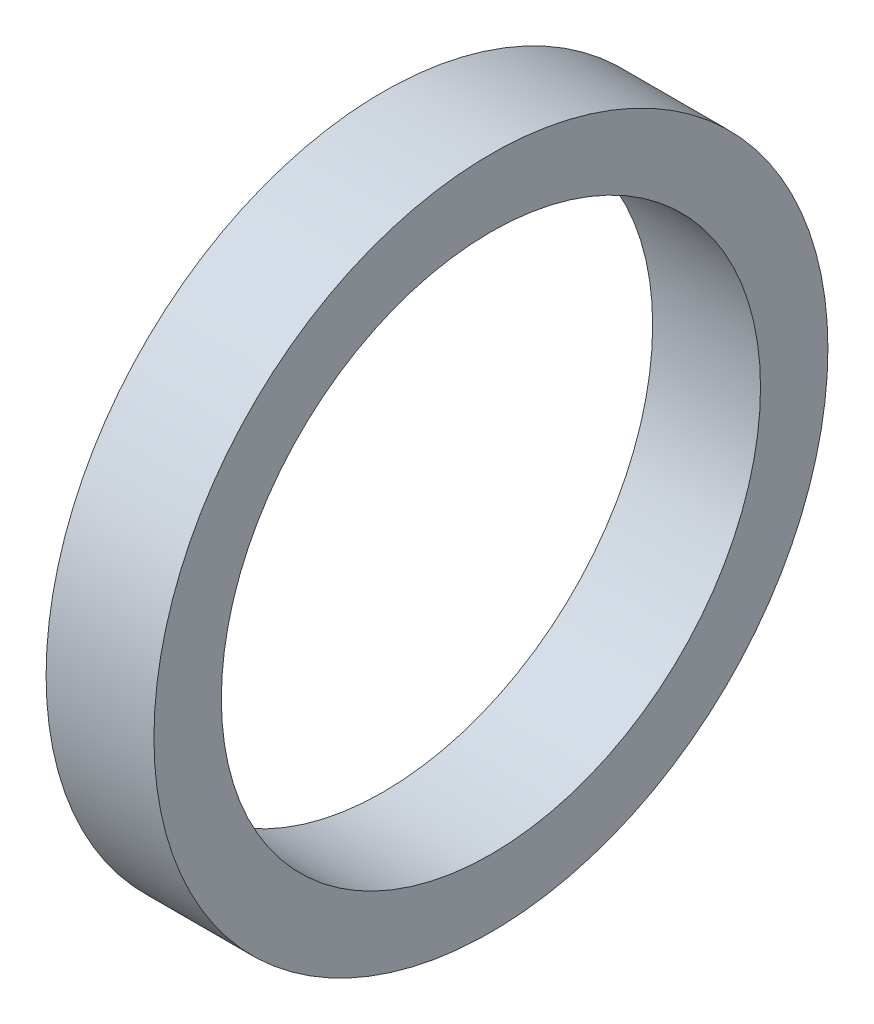
ISO-10303-21;
HEADER;
FILE_DESCRIPTION(('STEP AP214'),'2;1');
FILE_NAME('part.step','',(''),(''),'','','');
FILE_SCHEMA(('AUTOMOTIVE_DESIGN { 1 0 10303 214 1 1 1 1 }'));
ENDSEC;
DATA;
#1=APPLICATION_CONTEXT('core data for automotive mechanical design processes');
#2=APPLICATION_PROTOCOL_DEFINITION('international standard','automotive_design',2000,#1);
#3=PRODUCT_CONTEXT('',#1,'mechanical');
#4=PRODUCT('Part','Part','',(#3));
#5=PRODUCT_RELATED_PRODUCT_CATEGORY('part','',(#4));
#6=PRODUCT_DEFINITION_FORMATION('','',#4);
#7=PRODUCT_DEFINITION_CONTEXT('part definition',#1,'design');
#8=PRODUCT_DEFINITION('design','',#6,#7);
#9=PRODUCT_DEFINITION_SHAPE('','',#8);
#10=(LENGTH_UNIT() NAMED_UNIT(*) SI_UNIT(.MILLI.,.METRE.));
#11=(NAMED_UNIT(*) PLANE_ANGLE_UNIT() SI_UNIT($,.RADIAN.));
#12=(NAMED_UNIT(*) SI_UNIT($,.STERADIAN.) SOLID_ANGLE_UNIT());
#13=UNCERTAINTY_MEASURE_WITH_UNIT(LENGTH_MEASURE(1.E-05),#10,'distance_accuracy_value','');
#14=(GEOMETRIC_REPRESENTATION_CONTEXT(3) GLOBAL_UNCERTAINTY_ASSIGNED_CONTEXT((#13)) GLOBAL_UNIT_ASSIGNED_CONTEXT((#10,
#11,#12)) REPRESENTATION_CONTEXT('',''));
#15=CARTESIAN_POINT('',(0.,0.,0.));
#16=DIRECTION('',(0.,0.,1.));
#17=DIRECTION('',(1.,0.,0.));
#18=AXIS2_PLACEMENT_3D('',#15,#16,#17);
#19=CARTESIAN_POINT('',(8.,0.,0.));
#20=DIRECTION('',(1.,0.,0.));
#21=DIRECTION('',(0.,0.,-1.));
#22=AXIS2_PLACEMENT_3D('',#19,#20,#21);
#23=PLANE('',#22);
#24=CARTESIAN_POINT('',(8.,0.,0.));
#25=DIRECTION('',(1.,0.,0.));
#26=DIRECTION('',(0.,0.,-1.));
#27=AXIS2_PLACEMENT_3D('',#24,#25,#26);
#28=CIRCLE('',#27,25.);
#29=CARTESIAN_POINT('',(8.,0.,-25.));
#30=VERTEX_POINT('',#29);
#31=EDGE_CURVE('E10',#30,#30,#28,.T.);
#32=ORIENTED_EDGE('',*,*,#31,.T.);
#33=EDGE_LOOP('',(#32));
#34=FACE_BOUND('',#33,.T.);
#35=CARTESIAN_POINT('',(8.,0.,0.));
#36=DIRECTION('',(1.,0.,0.));
#37=DIRECTION('',(0.,0.,-1.));
#38=AXIS2_PLACEMENT_3D('',#35,#36,#37);
#39=CIRCLE('',#38,20.);
#40=CARTESIAN_POINT('',(8.,0.,-20.));
#41=VERTEX_POINT('',#40);
#42=EDGE_CURVE('E50',#41,#41,#39,.T.);
#43=ORIENTED_EDGE('',*,*,#42,.F.);
#44=EDGE_LOOP('',(#43));
#45=FACE_BOUND('',#44,.T.);
#46=ADVANCED_FACE('F37',(#34,#45),#23,.T.);
#47=CARTESIAN_POINT('',(0.,0.,0.));
#48=DIRECTION('',(1.,0.,0.));
#49=DIRECTION('',(0.,0.,-1.));
#50=AXIS2_PLACEMENT_3D('',#47,#48,#49);
#51=PLANE('',#50);
#52=CARTESIAN_POINT('',(0.,0.,0.));
#53=DIRECTION('',(1.,0.,0.));
#54=DIRECTION('',(0.,0.,-1.));
#55=AXIS2_PLACEMENT_3D('',#52,#53,#54);
#56=CIRCLE('',#55,25.);
#57=CARTESIAN_POINT('',(0.,0.,-25.));
#58=VERTEX_POINT('',#57);
#59=EDGE_CURVE('E41',#58,#58,#56,.T.);
#60=ORIENTED_EDGE('',*,*,#59,.F.);
#61=EDGE_LOOP('',(#60));
#62=FACE_BOUND('',#61,.T.);
#63=CARTESIAN_POINT('',(0.,0.,0.));
#64=DIRECTION('',(1.,0.,0.));
#65=DIRECTION('',(0.,0.,-1.));
#66=AXIS2_PLACEMENT_3D('',#63,#64,#65);
#67=CIRCLE('',#66,20.);
#68=CARTESIAN_POINT('',(0.,0.,-20.));
#69=VERTEX_POINT('',#68);
#70=EDGE_CURVE('E52',#69,#69,#67,.T.);
#71=ORIENTED_EDGE('',*,*,#70,.T.);
#72=EDGE_LOOP('',(#71));
#73=FACE_BOUND('',#72,.T.);
#74=ADVANCED_FACE('F64',(#62,#73),#51,.F.);
#75=CARTESIAN_POINT('',(8.,0.,0.));
#76=DIRECTION('',(-1.,0.,0.));
#77=DIRECTION('',(0.,0.,1.));
#78=AXIS2_PLACEMENT_3D('',#75,#76,#77);
#79=CYLINDRICAL_SURFACE('',#78,25.);
#80=ORIENTED_EDGE('',*,*,#31,.F.);
#81=EDGE_LOOP('',(#80));
#82=FACE_BOUND('',#81,.T.);
#83=ORIENTED_EDGE('',*,*,#59,.T.);
#84=EDGE_LOOP('',(#83));
#85=FACE_BOUND('',#84,.T.);
#86=ADVANCED_FACE('F39',(#82,#85),#79,.T.);
#87=CARTESIAN_POINT('',(8.,0.,0.));
#88=DIRECTION('',(-1.,0.,0.));
#89=DIRECTION('',(0.,0.,1.));
#90=AXIS2_PLACEMENT_3D('',#87,#88,#89);
#91=CYLINDRICAL_SURFACE('',#90,20.);
#92=ORIENTED_EDGE('',*,*,#42,.T.);
#93=EDGE_LOOP('',(#92));
#94=FACE_BOUND('',#93,.T.);
#95=ORIENTED_EDGE('',*,*,#70,.F.);
#96=EDGE_LOOP('',(#95));
#97=FACE_BOUND('',#96,.T.);
#98=ADVANCED_FACE('F60',(#94,#97),#91,.F.);
#99=CLOSED_SHELL('',(#46,#74,#86,#98));
#100=MANIFOLD_SOLID_BREP('B2',#99);
#101=ADVANCED_BREP_SHAPE_REPRESENTATION('',(#18,#100),#14);
#102=SHAPE_DEFINITION_REPRESENTATION(#9,#101);
ENDSEC;
END-ISO-10303-21;
